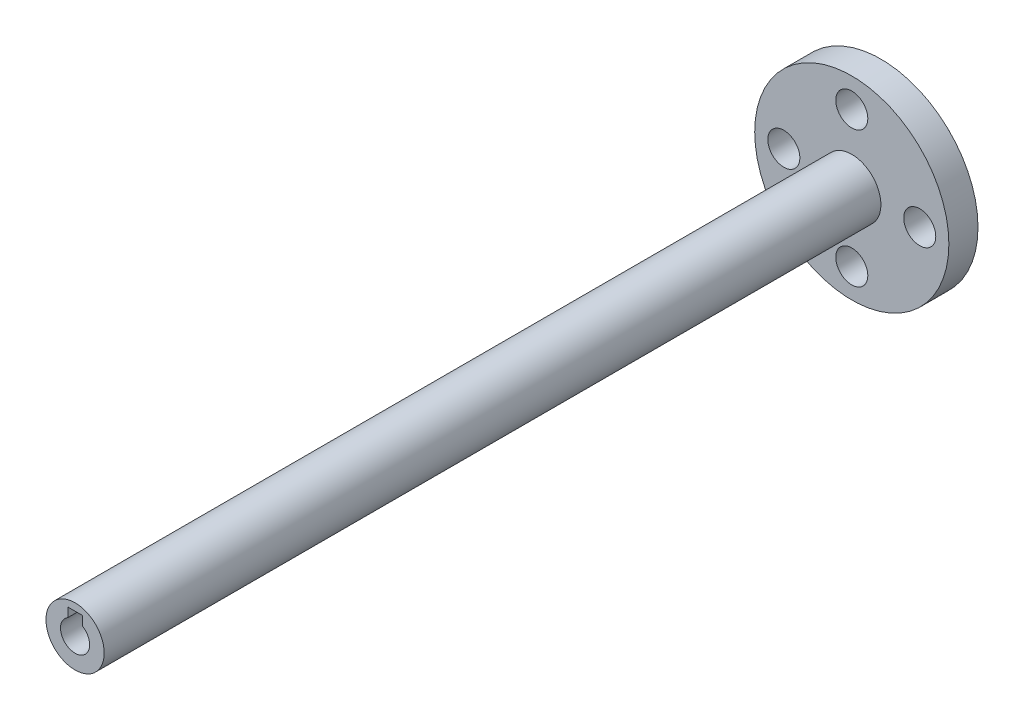
ISO-10303-21;
HEADER;
FILE_DESCRIPTION(('STEP AP214'),'2;1');
FILE_NAME('part.step','',(''),(''),'','','');
FILE_SCHEMA(('AUTOMOTIVE_DESIGN { 1 0 10303 214 1 1 1 1 }'));
ENDSEC;
DATA;
#1=APPLICATION_CONTEXT('core data for automotive mechanical design processes');
#2=APPLICATION_PROTOCOL_DEFINITION('international standard','automotive_design',2000,#1);
#3=PRODUCT_CONTEXT('',#1,'mechanical');
#4=PRODUCT('Part','Part','',(#3));
#5=PRODUCT_RELATED_PRODUCT_CATEGORY('part','',(#4));
#6=PRODUCT_DEFINITION_FORMATION('','',#4);
#7=PRODUCT_DEFINITION_CONTEXT('part definition',#1,'design');
#8=PRODUCT_DEFINITION('design','',#6,#7);
#9=PRODUCT_DEFINITION_SHAPE('','',#8);
#10=(LENGTH_UNIT() NAMED_UNIT(*) SI_UNIT(.MILLI.,.METRE.));
#11=(NAMED_UNIT(*) PLANE_ANGLE_UNIT() SI_UNIT($,.RADIAN.));
#12=(NAMED_UNIT(*) SI_UNIT($,.STERADIAN.) SOLID_ANGLE_UNIT());
#13=UNCERTAINTY_MEASURE_WITH_UNIT(LENGTH_MEASURE(1.E-05),#10,'distance_accuracy_value','');
#14=(GEOMETRIC_REPRESENTATION_CONTEXT(3) GLOBAL_UNCERTAINTY_ASSIGNED_CONTEXT((#13)) GLOBAL_UNIT_ASSIGNED_CONTEXT((#10,
#11,#12)) REPRESENTATION_CONTEXT('',''));
#15=CARTESIAN_POINT('',(0.,0.,0.));
#16=DIRECTION('',(0.,0.,1.));
#17=DIRECTION('',(1.,0.,0.));
#18=AXIS2_PLACEMENT_3D('',#15,#16,#17);
#19=CARTESIAN_POINT('',(0.,0.,3.));
#20=DIRECTION('',(0.,0.,1.));
#21=DIRECTION('',(1.,0.,0.));
#22=AXIS2_PLACEMENT_3D('',#19,#20,#21);
#23=PLANE('',#22);
#24=CARTESIAN_POINT('',(0.,0.,3.));
#25=DIRECTION('',(0.,0.,1.));
#26=DIRECTION('',(1.,0.,0.));
#27=AXIS2_PLACEMENT_3D('',#24,#25,#26);
#28=CIRCLE('',#27,3.);
#29=CARTESIAN_POINT('',(3.,0.,3.));
#30=VERTEX_POINT('',#29);
#31=EDGE_CURVE('E126',#30,#30,#28,.T.);
#32=ORIENTED_EDGE('',*,*,#31,.F.);
#33=EDGE_LOOP('',(#32));
#34=FACE_BOUND('',#33,.T.);
#35=CARTESIAN_POINT('',(0.,-7.,3.));
#36=DIRECTION('',(0.,0.,1.));
#37=DIRECTION('',(1.,0.,0.));
#38=AXIS2_PLACEMENT_3D('',#35,#36,#37);
#39=CIRCLE('',#38,1.65);
#40=CARTESIAN_POINT('',(1.65,-7.,3.));
#41=VERTEX_POINT('',#40);
#42=EDGE_CURVE('E147',#41,#41,#39,.T.);
#43=ORIENTED_EDGE('',*,*,#42,.F.);
#44=EDGE_LOOP('',(#43));
#45=FACE_BOUND('',#44,.T.);
#46=CARTESIAN_POINT('',(0.,7.,3.));
#47=DIRECTION('',(0.,0.,1.));
#48=DIRECTION('',(1.,0.,0.));
#49=AXIS2_PLACEMENT_3D('',#46,#47,#48);
#50=CIRCLE('',#49,1.65);
#51=CARTESIAN_POINT('',(1.65,7.,3.));
#52=VERTEX_POINT('',#51);
#53=EDGE_CURVE('E163',#52,#52,#50,.T.);
#54=ORIENTED_EDGE('',*,*,#53,.F.);
#55=EDGE_LOOP('',(#54));
#56=FACE_BOUND('',#55,.T.);
#57=CARTESIAN_POINT('',(0.,0.,3.));
#58=DIRECTION('',(0.,0.,1.));
#59=DIRECTION('',(1.,0.,0.));
#60=AXIS2_PLACEMENT_3D('',#57,#58,#59);
#61=CIRCLE('',#60,10.);
#62=CARTESIAN_POINT('',(10.,0.,3.));
#63=VERTEX_POINT('',#62);
#64=EDGE_CURVE('E11',#63,#63,#61,.T.);
#65=ORIENTED_EDGE('',*,*,#64,.T.);
#66=EDGE_LOOP('',(#65));
#67=FACE_BOUND('',#66,.T.);
#68=CARTESIAN_POINT('',(7.,0.,3.));
#69=DIRECTION('',(0.,0.,1.));
#70=DIRECTION('',(1.,0.,0.));
#71=AXIS2_PLACEMENT_3D('',#68,#69,#70);
#72=CIRCLE('',#71,1.65);
#73=CARTESIAN_POINT('',(8.65,0.,3.));
#74=VERTEX_POINT('',#73);
#75=EDGE_CURVE('E155',#74,#74,#72,.T.);
#76=ORIENTED_EDGE('',*,*,#75,.F.);
#77=EDGE_LOOP('',(#76));
#78=FACE_BOUND('',#77,.T.);
#79=CARTESIAN_POINT('',(-7.,0.,3.));
#80=DIRECTION('',(0.,0.,1.));
#81=DIRECTION('',(1.,0.,0.));
#82=AXIS2_PLACEMENT_3D('',#79,#80,#81);
#83=CIRCLE('',#82,1.65);
#84=CARTESIAN_POINT('',(-5.35,0.,3.));
#85=VERTEX_POINT('',#84);
#86=EDGE_CURVE('E139',#85,#85,#83,.T.);
#87=ORIENTED_EDGE('',*,*,#86,.F.);
#88=EDGE_LOOP('',(#87));
#89=FACE_BOUND('',#88,.T.);
#90=ADVANCED_FACE('F39',(#34,#45,#56,#67,#78,#89),#23,.T.);
#91=CARTESIAN_POINT('',(0.,0.,0.));
#92=DIRECTION('',(0.,0.,1.));
#93=DIRECTION('',(1.,0.,0.));
#94=AXIS2_PLACEMENT_3D('',#91,#92,#93);
#95=PLANE('',#94);
#96=CARTESIAN_POINT('',(0.,0.,0.));
#97=DIRECTION('',(0.,0.,1.));
#98=DIRECTION('',(1.,0.,0.));
#99=AXIS2_PLACEMENT_3D('',#96,#97,#98);
#100=CIRCLE('',#99,10.);
#101=CARTESIAN_POINT('',(10.,0.,0.));
#102=VERTEX_POINT('',#101);
#103=EDGE_CURVE('E43',#102,#102,#100,.T.);
#104=ORIENTED_EDGE('',*,*,#103,.F.);
#105=EDGE_LOOP('',(#104));
#106=FACE_BOUND('',#105,.T.);
#107=CARTESIAN_POINT('',(0.,7.,0.));
#108=DIRECTION('',(0.,0.,1.));
#109=DIRECTION('',(1.,0.,0.));
#110=AXIS2_PLACEMENT_3D('',#107,#108,#109);
#111=CIRCLE('',#110,1.65);
#112=CARTESIAN_POINT('',(1.65,7.,0.));
#113=VERTEX_POINT('',#112);
#114=EDGE_CURVE('E159',#113,#113,#111,.T.);
#115=ORIENTED_EDGE('',*,*,#114,.T.);
#116=EDGE_LOOP('',(#115));
#117=FACE_BOUND('',#116,.T.);
#118=CARTESIAN_POINT('',(7.,0.,0.));
#119=DIRECTION('',(0.,0.,1.));
#120=DIRECTION('',(1.,0.,0.));
#121=AXIS2_PLACEMENT_3D('',#118,#119,#120);
#122=CIRCLE('',#121,1.65);
#123=CARTESIAN_POINT('',(8.65,0.,0.));
#124=VERTEX_POINT('',#123);
#125=EDGE_CURVE('E151',#124,#124,#122,.T.);
#126=ORIENTED_EDGE('',*,*,#125,.T.);
#127=EDGE_LOOP('',(#126));
#128=FACE_BOUND('',#127,.T.);
#129=CARTESIAN_POINT('',(0.,-7.,0.));
#130=DIRECTION('',(0.,0.,1.));
#131=DIRECTION('',(1.,0.,0.));
#132=AXIS2_PLACEMENT_3D('',#129,#130,#131);
#133=CIRCLE('',#132,1.65);
#134=CARTESIAN_POINT('',(1.65,-7.,0.));
#135=VERTEX_POINT('',#134);
#136=EDGE_CURVE('E143',#135,#135,#133,.T.);
#137=ORIENTED_EDGE('',*,*,#136,.T.);
#138=EDGE_LOOP('',(#137));
#139=FACE_BOUND('',#138,.T.);
#140=CARTESIAN_POINT('',(-7.,0.,0.));
#141=DIRECTION('',(0.,0.,1.));
#142=DIRECTION('',(1.,0.,0.));
#143=AXIS2_PLACEMENT_3D('',#140,#141,#142);
#144=CIRCLE('',#143,1.65);
#145=CARTESIAN_POINT('',(-5.35,0.,0.));
#146=VERTEX_POINT('',#145);
#147=EDGE_CURVE('E135',#146,#146,#144,.T.);
#148=ORIENTED_EDGE('',*,*,#147,.T.);
#149=EDGE_LOOP('',(#148));
#150=FACE_BOUND('',#149,.T.);
#151=ADVANCED_FACE('F171',(#106,#117,#128,#139,#150),#95,.F.);
#152=CARTESIAN_POINT('',(0.,0.,3.));
#153=DIRECTION('',(0.,0.,-1.));
#154=DIRECTION('',(-1.,0.,0.));
#155=AXIS2_PLACEMENT_3D('',#152,#153,#154);
#156=CYLINDRICAL_SURFACE('',#155,10.);
#157=ORIENTED_EDGE('',*,*,#64,.F.);
#158=EDGE_LOOP('',(#157));
#159=FACE_BOUND('',#158,.T.);
#160=ORIENTED_EDGE('',*,*,#103,.T.);
#161=EDGE_LOOP('',(#160));
#162=FACE_BOUND('',#161,.T.);
#163=ADVANCED_FACE('F41',(#159,#162),#156,.T.);
#164=CARTESIAN_POINT('',(0.,7.,3.));
#165=DIRECTION('',(0.,0.,-1.));
#166=DIRECTION('',(-1.,0.,0.));
#167=AXIS2_PLACEMENT_3D('',#164,#165,#166);
#168=CYLINDRICAL_SURFACE('',#167,1.65);
#169=ORIENTED_EDGE('',*,*,#53,.T.);
#170=EDGE_LOOP('',(#169));
#171=FACE_BOUND('',#170,.T.);
#172=ORIENTED_EDGE('',*,*,#114,.F.);
#173=EDGE_LOOP('',(#172));
#174=FACE_BOUND('',#173,.T.);
#175=ADVANCED_FACE('F174',(#171,#174),#168,.F.);
#176=CARTESIAN_POINT('',(7.,0.,3.));
#177=DIRECTION('',(0.,0.,-1.));
#178=DIRECTION('',(-1.,0.,0.));
#179=AXIS2_PLACEMENT_3D('',#176,#177,#178);
#180=CYLINDRICAL_SURFACE('',#179,1.65);
#181=ORIENTED_EDGE('',*,*,#75,.T.);
#182=EDGE_LOOP('',(#181));
#183=FACE_BOUND('',#182,.T.);
#184=ORIENTED_EDGE('',*,*,#125,.F.);
#185=EDGE_LOOP('',(#184));
#186=FACE_BOUND('',#185,.T.);
#187=ADVANCED_FACE('F176',(#183,#186),#180,.F.);
#188=CARTESIAN_POINT('',(0.,-7.,3.));
#189=DIRECTION('',(0.,0.,-1.));
#190=DIRECTION('',(-1.,0.,0.));
#191=AXIS2_PLACEMENT_3D('',#188,#189,#190);
#192=CYLINDRICAL_SURFACE('',#191,1.65);
#193=ORIENTED_EDGE('',*,*,#42,.T.);
#194=EDGE_LOOP('',(#193));
#195=FACE_BOUND('',#194,.T.);
#196=ORIENTED_EDGE('',*,*,#136,.F.);
#197=EDGE_LOOP('',(#196));
#198=FACE_BOUND('',#197,.T.);
#199=ADVANCED_FACE('F183',(#195,#198),#192,.F.);
#200=CARTESIAN_POINT('',(-7.,0.,3.));
#201=DIRECTION('',(0.,0.,-1.));
#202=DIRECTION('',(-1.,0.,0.));
#203=AXIS2_PLACEMENT_3D('',#200,#201,#202);
#204=CYLINDRICAL_SURFACE('',#203,1.65);
#205=ORIENTED_EDGE('',*,*,#86,.T.);
#206=EDGE_LOOP('',(#205));
#207=FACE_BOUND('',#206,.T.);
#208=ORIENTED_EDGE('',*,*,#147,.F.);
#209=EDGE_LOOP('',(#208));
#210=FACE_BOUND('',#209,.T.);
#211=ADVANCED_FACE('F206',(#207,#210),#204,.F.);
#212=CARTESIAN_POINT('',(0.,0.,83.));
#213=DIRECTION('',(0.,0.,-1.));
#214=DIRECTION('',(-1.,0.,0.));
#215=AXIS2_PLACEMENT_3D('',#212,#213,#214);
#216=CYLINDRICAL_SURFACE('',#215,3.);
#217=CARTESIAN_POINT('',(0.,0.,83.));
#218=DIRECTION('',(0.,0.,1.));
#219=DIRECTION('',(1.,0.,0.));
#220=AXIS2_PLACEMENT_3D('',#217,#218,#219);
#221=CIRCLE('',#220,3.);
#222=CARTESIAN_POINT('',(3.,0.,83.));
#223=VERTEX_POINT('',#222);
#224=EDGE_CURVE('E131',#223,#223,#221,.T.);
#225=ORIENTED_EDGE('',*,*,#224,.F.);
#226=EDGE_LOOP('',(#225));
#227=FACE_BOUND('',#226,.T.);
#228=ORIENTED_EDGE('',*,*,#31,.T.);
#229=EDGE_LOOP('',(#228));
#230=FACE_BOUND('',#229,.T.);
#231=ADVANCED_FACE('F209',(#227,#230),#216,.T.);
#232=CARTESIAN_POINT('',(0.,0.,83.));
#233=DIRECTION('',(0.,0.,1.));
#234=DIRECTION('',(1.,0.,0.));
#235=AXIS2_PLACEMENT_3D('',#232,#233,#234);
#236=PLANE('',#235);
#237=DIRECTION('',(0.,1.,0.));
#238=VECTOR('',#237,1.);
#239=CARTESIAN_POINT('',(0.75,1.29903810567666,83.));
#240=LINE('',#239,#238);
#241=CARTESIAN_POINT('',(0.749999999999999,1.29903810567666,83.));
#242=VERTEX_POINT('',#241);
#243=CARTESIAN_POINT('',(0.75,2.25,83.));
#244=VERTEX_POINT('',#243);
#245=EDGE_CURVE('E55',#242,#244,#240,.T.);
#246=ORIENTED_EDGE('',*,*,#245,.F.);
#247=CARTESIAN_POINT('',(0.,0.,83.));
#248=DIRECTION('',(0.,0.,1.));
#249=DIRECTION('',(1.,0.,0.));
#250=AXIS2_PLACEMENT_3D('',#247,#248,#249);
#251=CIRCLE('',#250,1.5);
#252=CARTESIAN_POINT('',(-0.75,1.29903810567666,83.));
#253=VERTEX_POINT('',#252);
#254=EDGE_CURVE('E110',#253,#242,#251,.T.);
#255=ORIENTED_EDGE('',*,*,#254,.F.);
#256=DIRECTION('',(0.,-1.,0.));
#257=VECTOR('',#256,1.);
#258=CARTESIAN_POINT('',(-0.75,1.29903810567666,83.));
#259=LINE('',#258,#257);
#260=CARTESIAN_POINT('',(-0.75,2.25,83.));
#261=VERTEX_POINT('',#260);
#262=EDGE_CURVE('E119',#261,#253,#259,.T.);
#263=ORIENTED_EDGE('',*,*,#262,.F.);
#264=DIRECTION('',(-1.,0.,0.));
#265=VECTOR('',#264,1.);
#266=CARTESIAN_POINT('',(-0.75,2.25,83.));
#267=LINE('',#266,#265);
#268=EDGE_CURVE('E90',#244,#261,#267,.T.);
#269=ORIENTED_EDGE('',*,*,#268,.F.);
#270=EDGE_LOOP('',(#246,#255,#263,#269));
#271=FACE_BOUND('',#270,.T.);
#272=ORIENTED_EDGE('',*,*,#224,.T.);
#273=EDGE_LOOP('',(#272));
#274=FACE_BOUND('',#273,.T.);
#275=ADVANCED_FACE('F217',(#271,#274),#236,.T.);
#276=CARTESIAN_POINT('',(0.75,1.29903810567666,63.));
#277=DIRECTION('',(1.,0.,0.));
#278=DIRECTION('',(0.,1.,0.));
#279=AXIS2_PLACEMENT_3D('',#276,#277,#278);
#280=PLANE('',#279);
#281=ORIENTED_EDGE('',*,*,#245,.T.);
#282=DIRECTION('',(0.,0.,1.));
#283=VECTOR('',#282,1.);
#284=CARTESIAN_POINT('',(0.75,2.25,63.));
#285=LINE('',#284,#283);
#286=CARTESIAN_POINT('',(0.75,2.25,63.));
#287=VERTEX_POINT('',#286);
#288=EDGE_CURVE('E78',#287,#244,#285,.T.);
#289=ORIENTED_EDGE('',*,*,#288,.F.);
#290=DIRECTION('',(0.,1.,0.));
#291=VECTOR('',#290,1.);
#292=CARTESIAN_POINT('',(0.75,1.29903810567666,63.));
#293=LINE('',#292,#291);
#294=CARTESIAN_POINT('',(0.749999999999999,1.29903810567666,63.));
#295=VERTEX_POINT('',#294);
#296=EDGE_CURVE('E106',#295,#287,#293,.T.);
#297=ORIENTED_EDGE('',*,*,#296,.F.);
#298=DIRECTION('',(0.,0.,1.));
#299=VECTOR('',#298,1.);
#300=CARTESIAN_POINT('',(0.749999999999999,1.29903810567666,63.));
#301=LINE('',#300,#299);
#302=EDGE_CURVE('E63',#295,#242,#301,.T.);
#303=ORIENTED_EDGE('',*,*,#302,.T.);
#304=EDGE_LOOP('',(#281,#289,#297,#303));
#305=FACE_BOUND('',#304,.T.);
#306=ADVANCED_FACE('F225',(#305),#280,.F.);
#307=CARTESIAN_POINT('',(0.,0.,63.));
#308=DIRECTION('',(0.,0.,1.));
#309=DIRECTION('',(1.,0.,0.));
#310=AXIS2_PLACEMENT_3D('',#307,#308,#309);
#311=CYLINDRICAL_SURFACE('',#310,1.5);
#312=ORIENTED_EDGE('',*,*,#254,.T.);
#313=ORIENTED_EDGE('',*,*,#302,.F.);
#314=CARTESIAN_POINT('',(0.,0.,63.));
#315=DIRECTION('',(0.,0.,1.));
#316=DIRECTION('',(1.,0.,0.));
#317=AXIS2_PLACEMENT_3D('',#314,#315,#316);
#318=CIRCLE('',#317,1.5);
#319=CARTESIAN_POINT('',(-0.75,1.29903810567666,63.));
#320=VERTEX_POINT('',#319);
#321=EDGE_CURVE('E103',#320,#295,#318,.T.);
#322=ORIENTED_EDGE('',*,*,#321,.F.);
#323=DIRECTION('',(0.,0.,1.));
#324=VECTOR('',#323,1.);
#325=CARTESIAN_POINT('',(-0.75,1.29903810567666,63.));
#326=LINE('',#325,#324);
#327=EDGE_CURVE('E95',#320,#253,#326,.T.);
#328=ORIENTED_EDGE('',*,*,#327,.T.);
#329=EDGE_LOOP('',(#312,#313,#322,#328));
#330=FACE_BOUND('',#329,.T.);
#331=ADVANCED_FACE('F229',(#330),#311,.F.);
#332=CARTESIAN_POINT('',(-0.75,1.29903810567666,63.));
#333=DIRECTION('',(-1.,0.,0.));
#334=DIRECTION('',(0.,-1.,0.));
#335=AXIS2_PLACEMENT_3D('',#332,#333,#334);
#336=PLANE('',#335);
#337=ORIENTED_EDGE('',*,*,#262,.T.);
#338=ORIENTED_EDGE('',*,*,#327,.F.);
#339=DIRECTION('',(0.,-1.,0.));
#340=VECTOR('',#339,1.);
#341=CARTESIAN_POINT('',(-0.75,1.29903810567666,63.));
#342=LINE('',#341,#340);
#343=CARTESIAN_POINT('',(-0.75,2.25,63.));
#344=VERTEX_POINT('',#343);
#345=EDGE_CURVE('E98',#344,#320,#342,.T.);
#346=ORIENTED_EDGE('',*,*,#345,.F.);
#347=DIRECTION('',(0.,0.,1.));
#348=VECTOR('',#347,1.);
#349=CARTESIAN_POINT('',(-0.75,2.25,63.));
#350=LINE('',#349,#348);
#351=EDGE_CURVE('E83',#344,#261,#350,.T.);
#352=ORIENTED_EDGE('',*,*,#351,.T.);
#353=EDGE_LOOP('',(#337,#338,#346,#352));
#354=FACE_BOUND('',#353,.T.);
#355=ADVANCED_FACE('F99',(#354),#336,.F.);
#356=CARTESIAN_POINT('',(-0.75,2.25,63.));
#357=DIRECTION('',(0.,1.,0.));
#358=DIRECTION('',(0.,0.,1.));
#359=AXIS2_PLACEMENT_3D('',#356,#357,#358);
#360=PLANE('',#359);
#361=ORIENTED_EDGE('',*,*,#268,.T.);
#362=ORIENTED_EDGE('',*,*,#351,.F.);
#363=DIRECTION('',(-1.,0.,0.));
#364=VECTOR('',#363,1.);
#365=CARTESIAN_POINT('',(-0.75,2.25,63.));
#366=LINE('',#365,#364);
#367=EDGE_CURVE('E87',#287,#344,#366,.T.);
#368=ORIENTED_EDGE('',*,*,#367,.F.);
#369=ORIENTED_EDGE('',*,*,#288,.T.);
#370=EDGE_LOOP('',(#361,#362,#368,#369));
#371=FACE_BOUND('',#370,.T.);
#372=ADVANCED_FACE('F85',(#371),#360,.F.);
#373=CARTESIAN_POINT('',(0.,0.,63.));
#374=DIRECTION('',(0.,0.,1.));
#375=DIRECTION('',(1.,0.,0.));
#376=AXIS2_PLACEMENT_3D('',#373,#374,#375);
#377=PLANE('',#376);
#378=ORIENTED_EDGE('',*,*,#296,.T.);
#379=ORIENTED_EDGE('',*,*,#367,.T.);
#380=ORIENTED_EDGE('',*,*,#345,.T.);
#381=ORIENTED_EDGE('',*,*,#321,.T.);
#382=EDGE_LOOP('',(#378,#379,#380,#381));
#383=FACE_BOUND('',#382,.T.);
#384=ADVANCED_FACE('F105',(#383),#377,.T.);
#385=CLOSED_SHELL('',(#90,#151,#163,#175,#187,#199,#211,#231,#275,#306,#331,#355,#372,#384));
#386=MANIFOLD_SOLID_BREP('B2',#385);
#387=ADVANCED_BREP_SHAPE_REPRESENTATION('',(#18,#386),#14);
#388=SHAPE_DEFINITION_REPRESENTATION(#9,#387);
ENDSEC;
END-ISO-10303-21;
